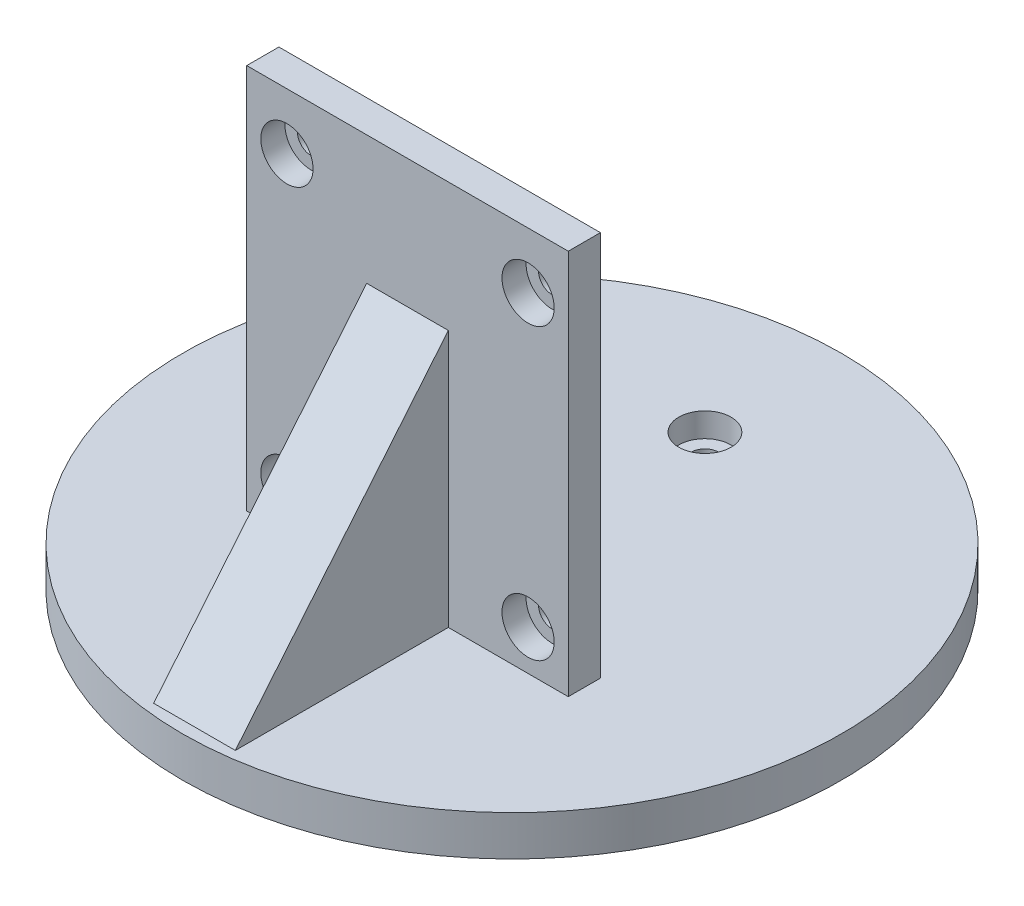
ISO-10303-21;
HEADER;
FILE_DESCRIPTION(('STEP AP214'),'2;1');
FILE_NAME('part.step','',(''),(''),'','','');
FILE_SCHEMA(('AUTOMOTIVE_DESIGN { 1 0 10303 214 1 1 1 1 }'));
ENDSEC;
DATA;
#1=APPLICATION_CONTEXT('core data for automotive mechanical design processes');
#2=APPLICATION_PROTOCOL_DEFINITION('international standard','automotive_design',2000,#1);
#3=PRODUCT_CONTEXT('',#1,'mechanical');
#4=PRODUCT('Part','Part','',(#3));
#5=PRODUCT_RELATED_PRODUCT_CATEGORY('part','',(#4));
#6=PRODUCT_DEFINITION_FORMATION('','',#4);
#7=PRODUCT_DEFINITION_CONTEXT('part definition',#1,'design');
#8=PRODUCT_DEFINITION('design','',#6,#7);
#9=PRODUCT_DEFINITION_SHAPE('','',#8);
#10=(LENGTH_UNIT() NAMED_UNIT(*) SI_UNIT(.MILLI.,.METRE.));
#11=(NAMED_UNIT(*) PLANE_ANGLE_UNIT() SI_UNIT($,.RADIAN.));
#12=(NAMED_UNIT(*) SI_UNIT($,.STERADIAN.) SOLID_ANGLE_UNIT());
#13=UNCERTAINTY_MEASURE_WITH_UNIT(LENGTH_MEASURE(1.E-05),#10,'distance_accuracy_value','');
#14=(GEOMETRIC_REPRESENTATION_CONTEXT(3) GLOBAL_UNCERTAINTY_ASSIGNED_CONTEXT((#13)) GLOBAL_UNIT_ASSIGNED_CONTEXT((#10,
#11,#12)) REPRESENTATION_CONTEXT('',''));
#15=CARTESIAN_POINT('',(0.,0.,0.));
#16=DIRECTION('',(0.,0.,1.));
#17=DIRECTION('',(1.,0.,0.));
#18=AXIS2_PLACEMENT_3D('',#15,#16,#17);
#19=CARTESIAN_POINT('',(0.,5.,0.));
#20=DIRECTION('',(0.,1.,0.));
#21=DIRECTION('',(0.,0.,1.));
#22=AXIS2_PLACEMENT_3D('',#19,#20,#21);
#23=PLANE('',#22);
#24=DIRECTION('',(-1.,0.,0.));
#25=VECTOR('',#24,1.);
#26=CARTESIAN_POINT('',(-19.,5.,-11.));
#27=LINE('',#26,#25);
#28=CARTESIAN_POINT('',(-14.1715728752538,5.,-11.));
#29=VERTEX_POINT('',#28);
#30=CARTESIAN_POINT('',(-19.,5.,-11.));
#31=VERTEX_POINT('',#30);
#32=EDGE_CURVE('E56',#29,#31,#27,.T.);
#33=ORIENTED_EDGE('',*,*,#32,.F.);
#34=DIRECTION('',(0.,0.,-1.));
#35=VECTOR('',#34,1.);
#36=CARTESIAN_POINT('',(-14.1715728752538,5.,4.58155072528997));
#37=LINE('',#36,#35);
#38=CARTESIAN_POINT('',(-14.1715728752538,5.,-0.999999999999992));
#39=VERTEX_POINT('',#38);
#40=EDGE_CURVE('E155',#39,#29,#37,.T.);
#41=ORIENTED_EDGE('',*,*,#40,.F.);
#42=DIRECTION('',(1.,0.,0.));
#43=VECTOR('',#42,1.);
#44=CARTESIAN_POINT('',(-19.,5.,-0.999999999999992));
#45=LINE('',#44,#43);
#46=CARTESIAN_POINT('',(-19.,5.,-0.999999999999992));
#47=VERTEX_POINT('',#46);
#48=EDGE_CURVE('E64',#47,#39,#45,.T.);
#49=ORIENTED_EDGE('',*,*,#48,.F.);
#50=DIRECTION('',(0.,0.,1.));
#51=VECTOR('',#50,1.);
#52=CARTESIAN_POINT('',(-19.,5.,-11.));
#53=LINE('',#52,#51);
#54=EDGE_CURVE('E160',#31,#47,#53,.T.);
#55=ORIENTED_EDGE('',*,*,#54,.F.);
#56=EDGE_LOOP('',(#33,#41,#49,#55));
#57=FACE_BOUND('',#56,.T.);
#58=CARTESIAN_POINT('',(0.,5.,0.));
#59=DIRECTION('',(0.,1.,0.));
#60=DIRECTION('',(0.,0.,1.));
#61=AXIS2_PLACEMENT_3D('',#58,#59,#60);
#62=CIRCLE('',#61,3.25);
#63=CARTESIAN_POINT('',(0.,5.,3.25));
#64=VERTEX_POINT('',#63);
#65=EDGE_CURVE('E165',#64,#64,#62,.T.);
#66=ORIENTED_EDGE('',*,*,#65,.F.);
#67=EDGE_LOOP('',(#66));
#68=FACE_BOUND('',#67,.T.);
#69=CARTESIAN_POINT('',(0.,5.,-24.));
#70=DIRECTION('',(0.,1.,0.));
#71=DIRECTION('',(0.,0.,1.));
#72=AXIS2_PLACEMENT_3D('',#69,#70,#71);
#73=CIRCLE('',#72,3.25);
#74=CARTESIAN_POINT('',(0.,5.,-20.75));
#75=VERTEX_POINT('',#74);
#76=EDGE_CURVE('E175',#75,#75,#73,.T.);
#77=ORIENTED_EDGE('',*,*,#76,.F.);
#78=EDGE_LOOP('',(#77));
#79=FACE_BOUND('',#78,.T.);
#80=CARTESIAN_POINT('',(0.,5.,0.));
#81=DIRECTION('',(0.,1.,0.));
#82=DIRECTION('',(0.,0.,1.));
#83=AXIS2_PLACEMENT_3D('',#80,#81,#82);
#84=CIRCLE('',#83,41.);
#85=CARTESIAN_POINT('',(0.,5.,41.));
#86=VERTEX_POINT('',#85);
#87=EDGE_CURVE('E11',#86,#86,#84,.T.);
#88=ORIENTED_EDGE('',*,*,#87,.T.);
#89=EDGE_LOOP('',(#88));
#90=FACE_BOUND('',#89,.T.);
#91=DIRECTION('',(0.,0.,1.));
#92=VECTOR('',#91,1.);
#93=CARTESIAN_POINT('',(20.,5.,9.));
#94=LINE('',#93,#92);
#95=CARTESIAN_POINT('',(20.,5.,9.));
#96=VERTEX_POINT('',#95);
#97=CARTESIAN_POINT('',(20.,5.,13.));
#98=VERTEX_POINT('',#97);
#99=EDGE_CURVE('E207',#96,#98,#94,.T.);
#100=ORIENTED_EDGE('',*,*,#99,.T.);
#101=DIRECTION('',(-1.,0.,0.));
#102=VECTOR('',#101,1.);
#103=CARTESIAN_POINT('',(20.,5.,13.));
#104=LINE('',#103,#102);
#105=CARTESIAN_POINT('',(5.08,5.,13.));
#106=VERTEX_POINT('',#105);
#107=EDGE_CURVE('E189',#98,#106,#104,.T.);
#108=ORIENTED_EDGE('',*,*,#107,.T.);
#109=DIRECTION('',(0.,0.,-1.));
#110=VECTOR('',#109,1.);
#111=CARTESIAN_POINT('',(5.08,5.,13.));
#112=LINE('',#111,#110);
#113=CARTESIAN_POINT('',(5.08,5.,39.5));
#114=VERTEX_POINT('',#113);
#115=EDGE_CURVE('E221',#114,#106,#112,.T.);
#116=ORIENTED_EDGE('',*,*,#115,.F.);
#117=DIRECTION('',(1.,0.,0.));
#118=VECTOR('',#117,1.);
#119=CARTESIAN_POINT('',(-5.08,5.,39.5));
#120=LINE('',#119,#118);
#121=CARTESIAN_POINT('',(-5.08,5.,39.5));
#122=VERTEX_POINT('',#121);
#123=EDGE_CURVE('E232',#122,#114,#120,.T.);
#124=ORIENTED_EDGE('',*,*,#123,.F.);
#125=DIRECTION('',(0.,0.,-1.));
#126=VECTOR('',#125,1.);
#127=CARTESIAN_POINT('',(-5.08,5.,13.));
#128=LINE('',#127,#126);
#129=CARTESIAN_POINT('',(-5.08,5.,13.));
#130=VERTEX_POINT('',#129);
#131=EDGE_CURVE('E228',#122,#130,#128,.T.);
#132=ORIENTED_EDGE('',*,*,#131,.T.);
#133=CARTESIAN_POINT('',(-20.,5.,13.));
#134=VERTEX_POINT('',#133);
#135=EDGE_CURVE('E203',#130,#134,#104,.T.);
#136=ORIENTED_EDGE('',*,*,#135,.T.);
#137=DIRECTION('',(0.,0.,1.));
#138=VECTOR('',#137,1.);
#139=CARTESIAN_POINT('',(-20.,5.,9.));
#140=LINE('',#139,#138);
#141=CARTESIAN_POINT('',(-20.,5.,9.));
#142=VERTEX_POINT('',#141);
#143=EDGE_CURVE('E195',#142,#134,#140,.T.);
#144=ORIENTED_EDGE('',*,*,#143,.F.);
#145=DIRECTION('',(-1.,0.,0.));
#146=VECTOR('',#145,1.);
#147=CARTESIAN_POINT('',(20.,5.,9.));
#148=LINE('',#147,#146);
#149=EDGE_CURVE('E193',#96,#142,#148,.T.);
#150=ORIENTED_EDGE('',*,*,#149,.F.);
#151=EDGE_LOOP('',(#100,#108,#116,#124,#132,#136,#144,#150));
#152=FACE_BOUND('',#151,.T.);
#153=ADVANCED_FACE('F39',(#57,#68,#79,#90,#152),#23,.T.);
#154=CARTESIAN_POINT('',(0.,5.,0.));
#155=DIRECTION('',(0.,-1.,0.));
#156=DIRECTION('',(0.,0.,-1.));
#157=AXIS2_PLACEMENT_3D('',#154,#155,#156);
#158=CYLINDRICAL_SURFACE('',#157,41.);
#159=ORIENTED_EDGE('',*,*,#87,.F.);
#160=EDGE_LOOP('',(#159));
#161=FACE_BOUND('',#160,.T.);
#162=CARTESIAN_POINT('',(0.,0.,0.));
#163=DIRECTION('',(0.,1.,0.));
#164=DIRECTION('',(0.,0.,1.));
#165=AXIS2_PLACEMENT_3D('',#162,#163,#164);
#166=CIRCLE('',#165,41.);
#167=CARTESIAN_POINT('',(0.,0.,41.));
#168=VERTEX_POINT('',#167);
#169=EDGE_CURVE('E48',#168,#168,#166,.T.);
#170=ORIENTED_EDGE('',*,*,#169,.T.);
#171=EDGE_LOOP('',(#170));
#172=FACE_BOUND('',#171,.T.);
#173=ADVANCED_FACE('F41',(#161,#172),#158,.T.);
#174=CARTESIAN_POINT('',(0.,0.,0.));
#175=DIRECTION('',(0.,1.,0.));
#176=DIRECTION('',(0.,0.,1.));
#177=AXIS2_PLACEMENT_3D('',#174,#175,#176);
#178=PLANE('',#177);
#179=CARTESIAN_POINT('',(0.,0.,0.));
#180=DIRECTION('',(0.,1.,0.));
#181=DIRECTION('',(0.,0.,1.));
#182=AXIS2_PLACEMENT_3D('',#179,#180,#181);
#183=CIRCLE('',#182,1.7);
#184=CARTESIAN_POINT('',(0.,0.,1.7));
#185=VERTEX_POINT('',#184);
#186=EDGE_CURVE('E174',#185,#185,#183,.T.);
#187=ORIENTED_EDGE('',*,*,#186,.T.);
#188=EDGE_LOOP('',(#187));
#189=FACE_BOUND('',#188,.T.);
#190=CARTESIAN_POINT('',(0.,0.,-24.));
#191=DIRECTION('',(0.,1.,0.));
#192=DIRECTION('',(0.,0.,1.));
#193=AXIS2_PLACEMENT_3D('',#190,#191,#192);
#194=CIRCLE('',#193,1.7);
#195=CARTESIAN_POINT('',(0.,0.,-22.3));
#196=VERTEX_POINT('',#195);
#197=EDGE_CURVE('E184',#196,#196,#194,.T.);
#198=ORIENTED_EDGE('',*,*,#197,.T.);
#199=EDGE_LOOP('',(#198));
#200=FACE_BOUND('',#199,.T.);
#201=ORIENTED_EDGE('',*,*,#169,.F.);
#202=EDGE_LOOP('',(#201));
#203=FACE_BOUND('',#202,.T.);
#204=ADVANCED_FACE('F337',(#189,#200,#203),#178,.F.);
#205=CARTESIAN_POINT('',(-5.08,5.,39.5));
#206=DIRECTION('',(0.,0.637813971185366,0.770190455771008));
#207=DIRECTION('',(0.,-0.770190455771008,0.637813971185366));
#208=AXIS2_PLACEMENT_3D('',#205,#206,#207);
#209=PLANE('',#208);
#210=ORIENTED_EDGE('',*,*,#123,.T.);
#211=DIRECTION('',(0.,-0.770190455771008,0.637813971185366));
#212=VECTOR('',#211,1.);
#213=CARTESIAN_POINT('',(5.08,5.,39.5));
#214=LINE('',#213,#212);
#215=CARTESIAN_POINT('',(5.08,37.,13.));
#216=VERTEX_POINT('',#215);
#217=EDGE_CURVE('E219',#216,#114,#214,.T.);
#218=ORIENTED_EDGE('',*,*,#217,.F.);
#219=DIRECTION('',(1.,0.,0.));
#220=VECTOR('',#219,1.);
#221=CARTESIAN_POINT('',(-5.08,37.,13.));
#222=LINE('',#221,#220);
#223=CARTESIAN_POINT('',(-5.08,37.,13.));
#224=VERTEX_POINT('',#223);
#225=EDGE_CURVE('E231',#224,#216,#222,.T.);
#226=ORIENTED_EDGE('',*,*,#225,.F.);
#227=DIRECTION('',(0.,-0.770190455771008,0.637813971185366));
#228=VECTOR('',#227,1.);
#229=CARTESIAN_POINT('',(-5.08,5.,39.5));
#230=LINE('',#229,#228);
#231=EDGE_CURVE('E226',#224,#122,#230,.T.);
#232=ORIENTED_EDGE('',*,*,#231,.T.);
#233=EDGE_LOOP('',(#210,#218,#226,#232));
#234=FACE_BOUND('',#233,.T.);
#235=ADVANCED_FACE('F308',(#234),#209,.T.);
#236=CARTESIAN_POINT('',(-5.08,0.,0.));
#237=DIRECTION('',(-1.,0.,0.));
#238=DIRECTION('',(0.,0.,1.));
#239=AXIS2_PLACEMENT_3D('',#236,#237,#238);
#240=PLANE('',#239);
#241=DIRECTION('',(0.,1.,0.));
#242=VECTOR('',#241,1.);
#243=CARTESIAN_POINT('',(-5.08,37.,13.));
#244=LINE('',#243,#242);
#245=EDGE_CURVE('E224',#130,#224,#244,.T.);
#246=ORIENTED_EDGE('',*,*,#245,.F.);
#247=ORIENTED_EDGE('',*,*,#131,.F.);
#248=ORIENTED_EDGE('',*,*,#231,.F.);
#249=EDGE_LOOP('',(#246,#247,#248));
#250=FACE_BOUND('',#249,.T.);
#251=ADVANCED_FACE('F312',(#250),#240,.T.);
#252=CARTESIAN_POINT('',(5.08,0.,0.));
#253=DIRECTION('',(-1.,0.,0.));
#254=DIRECTION('',(0.,0.,1.));
#255=AXIS2_PLACEMENT_3D('',#252,#253,#254);
#256=PLANE('',#255);
#257=DIRECTION('',(0.,1.,0.));
#258=VECTOR('',#257,1.);
#259=CARTESIAN_POINT('',(5.08,37.,13.));
#260=LINE('',#259,#258);
#261=EDGE_CURVE('E216',#106,#216,#260,.T.);
#262=ORIENTED_EDGE('',*,*,#261,.T.);
#263=ORIENTED_EDGE('',*,*,#217,.T.);
#264=ORIENTED_EDGE('',*,*,#115,.T.);
#265=EDGE_LOOP('',(#262,#263,#264));
#266=FACE_BOUND('',#265,.T.);
#267=ADVANCED_FACE('F303',(#266),#256,.F.);
#268=CARTESIAN_POINT('',(-20.,53.,9.00000000000001));
#269=DIRECTION('',(1.,0.,0.));
#270=DIRECTION('',(0.,1.,0.));
#271=AXIS2_PLACEMENT_3D('',#268,#269,#270);
#272=PLANE('',#271);
#273=DIRECTION('',(0.,1.,0.));
#274=VECTOR('',#273,1.);
#275=CARTESIAN_POINT('',(-20.,53.,13.));
#276=LINE('',#275,#274);
#277=CARTESIAN_POINT('',(-20.,53.,13.));
#278=VERTEX_POINT('',#277);
#279=EDGE_CURVE('E196',#134,#278,#276,.T.);
#280=ORIENTED_EDGE('',*,*,#279,.T.);
#281=DIRECTION('',(0.,0.,1.));
#282=VECTOR('',#281,1.);
#283=CARTESIAN_POINT('',(-20.,53.,9.00000000000001));
#284=LINE('',#283,#282);
#285=CARTESIAN_POINT('',(-20.,53.,9.00000000000001));
#286=VERTEX_POINT('',#285);
#287=EDGE_CURVE('E213',#286,#278,#284,.T.);
#288=ORIENTED_EDGE('',*,*,#287,.F.);
#289=DIRECTION('',(0.,1.,0.));
#290=VECTOR('',#289,1.);
#291=CARTESIAN_POINT('',(-20.,53.,9.00000000000001));
#292=LINE('',#291,#290);
#293=EDGE_CURVE('E185',#142,#286,#292,.T.);
#294=ORIENTED_EDGE('',*,*,#293,.F.);
#295=ORIENTED_EDGE('',*,*,#143,.T.);
#296=EDGE_LOOP('',(#280,#288,#294,#295));
#297=FACE_BOUND('',#296,.T.);
#298=ADVANCED_FACE('F316',(#297),#272,.F.);
#299=CARTESIAN_POINT('',(20.,53.,9.00000000000001));
#300=DIRECTION('',(0.,-1.,0.));
#301=DIRECTION('',(0.,0.,-1.));
#302=AXIS2_PLACEMENT_3D('',#299,#300,#301);
#303=PLANE('',#302);
#304=DIRECTION('',(1.,0.,0.));
#305=VECTOR('',#304,1.);
#306=CARTESIAN_POINT('',(20.,53.,13.));
#307=LINE('',#306,#305);
#308=CARTESIAN_POINT('',(20.,53.,13.));
#309=VERTEX_POINT('',#308);
#310=EDGE_CURVE('E199',#278,#309,#307,.T.);
#311=ORIENTED_EDGE('',*,*,#310,.T.);
#312=DIRECTION('',(0.,0.,1.));
#313=VECTOR('',#312,1.);
#314=CARTESIAN_POINT('',(20.,53.,9.00000000000001));
#315=LINE('',#314,#313);
#316=CARTESIAN_POINT('',(20.,53.,9.00000000000001));
#317=VERTEX_POINT('',#316);
#318=EDGE_CURVE('E210',#317,#309,#315,.T.);
#319=ORIENTED_EDGE('',*,*,#318,.F.);
#320=DIRECTION('',(1.,0.,0.));
#321=VECTOR('',#320,1.);
#322=CARTESIAN_POINT('',(20.,53.,9.00000000000001));
#323=LINE('',#322,#321);
#324=EDGE_CURVE('E188',#286,#317,#323,.T.);
#325=ORIENTED_EDGE('',*,*,#324,.F.);
#326=ORIENTED_EDGE('',*,*,#287,.T.);
#327=EDGE_LOOP('',(#311,#319,#325,#326));
#328=FACE_BOUND('',#327,.T.);
#329=ADVANCED_FACE('F321',(#328),#303,.F.);
#330=CARTESIAN_POINT('',(20.,53.,9.00000000000001));
#331=DIRECTION('',(-1.,0.,0.));
#332=DIRECTION('',(0.,-1.,0.));
#333=AXIS2_PLACEMENT_3D('',#330,#331,#332);
#334=PLANE('',#333);
#335=DIRECTION('',(0.,-1.,0.));
#336=VECTOR('',#335,1.);
#337=CARTESIAN_POINT('',(20.,53.,13.));
#338=LINE('',#337,#336);
#339=EDGE_CURVE('E201',#309,#98,#338,.T.);
#340=ORIENTED_EDGE('',*,*,#339,.T.);
#341=ORIENTED_EDGE('',*,*,#99,.F.);
#342=DIRECTION('',(0.,-1.,0.));
#343=VECTOR('',#342,1.);
#344=CARTESIAN_POINT('',(20.,53.,9.00000000000001));
#345=LINE('',#344,#343);
#346=EDGE_CURVE('E191',#317,#96,#345,.T.);
#347=ORIENTED_EDGE('',*,*,#346,.F.);
#348=ORIENTED_EDGE('',*,*,#318,.T.);
#349=EDGE_LOOP('',(#340,#341,#347,#348));
#350=FACE_BOUND('',#349,.T.);
#351=ADVANCED_FACE('F295',(#350),#334,.F.);
#352=CARTESIAN_POINT('',(0.,0.,9.));
#353=DIRECTION('',(0.,0.,-1.));
#354=DIRECTION('',(0.,1.,0.));
#355=AXIS2_PLACEMENT_3D('',#352,#353,#354);
#356=PLANE('',#355);
#357=CARTESIAN_POINT('',(15.,10.,9.));
#358=DIRECTION('',(0.,0.,-1.));
#359=DIRECTION('',(0.,1.,0.));
#360=AXIS2_PLACEMENT_3D('',#357,#358,#359);
#361=CIRCLE('',#360,1.7);
#362=CARTESIAN_POINT('',(15.,11.7,9.));
#363=VERTEX_POINT('',#362);
#364=EDGE_CURVE('E43',#363,#363,#361,.T.);
#365=ORIENTED_EDGE('',*,*,#364,.F.);
#366=EDGE_LOOP('',(#365));
#367=FACE_BOUND('',#366,.T.);
#368=CARTESIAN_POINT('',(-15.,10.,9.));
#369=DIRECTION('',(0.,0.,-1.));
#370=DIRECTION('',(0.,1.,0.));
#371=AXIS2_PLACEMENT_3D('',#368,#369,#370);
#372=CIRCLE('',#371,1.7);
#373=CARTESIAN_POINT('',(-15.,11.7,9.));
#374=VERTEX_POINT('',#373);
#375=EDGE_CURVE('E246',#374,#374,#372,.T.);
#376=ORIENTED_EDGE('',*,*,#375,.F.);
#377=EDGE_LOOP('',(#376));
#378=FACE_BOUND('',#377,.T.);
#379=CARTESIAN_POINT('',(-15.,46.,9.00000000000001));
#380=DIRECTION('',(0.,0.,-1.));
#381=DIRECTION('',(0.,1.,0.));
#382=AXIS2_PLACEMENT_3D('',#379,#380,#381);
#383=CIRCLE('',#382,1.7);
#384=CARTESIAN_POINT('',(-15.,47.7,9.00000000000001));
#385=VERTEX_POINT('',#384);
#386=EDGE_CURVE('E242',#385,#385,#383,.T.);
#387=ORIENTED_EDGE('',*,*,#386,.F.);
#388=EDGE_LOOP('',(#387));
#389=FACE_BOUND('',#388,.T.);
#390=CARTESIAN_POINT('',(15.,46.,9.00000000000001));
#391=DIRECTION('',(0.,0.,-1.));
#392=DIRECTION('',(0.,1.,0.));
#393=AXIS2_PLACEMENT_3D('',#390,#391,#392);
#394=CIRCLE('',#393,1.7);
#395=CARTESIAN_POINT('',(15.,47.7,9.00000000000001));
#396=VERTEX_POINT('',#395);
#397=EDGE_CURVE('E145',#396,#396,#394,.T.);
#398=ORIENTED_EDGE('',*,*,#397,.F.);
#399=EDGE_LOOP('',(#398));
#400=FACE_BOUND('',#399,.T.);
#401=ORIENTED_EDGE('',*,*,#293,.T.);
#402=ORIENTED_EDGE('',*,*,#324,.T.);
#403=ORIENTED_EDGE('',*,*,#346,.T.);
#404=ORIENTED_EDGE('',*,*,#149,.T.);
#405=EDGE_LOOP('',(#401,#402,#403,#404));
#406=FACE_BOUND('',#405,.T.);
#407=ADVANCED_FACE('F319',(#367,#378,#389,#400,#406),#356,.T.);
#408=CARTESIAN_POINT('',(0.,0.,13.));
#409=DIRECTION('',(0.,0.,-1.));
#410=DIRECTION('',(0.,1.,0.));
#411=AXIS2_PLACEMENT_3D('',#408,#409,#410);
#412=PLANE('',#411);
#413=CARTESIAN_POINT('',(15.,10.,13.));
#414=DIRECTION('',(0.,0.,1.));
#415=DIRECTION('',(1.,0.,0.));
#416=AXIS2_PLACEMENT_3D('',#413,#414,#415);
#417=CIRCLE('',#416,3.25);
#418=CARTESIAN_POINT('',(18.25,10.,13.));
#419=VERTEX_POINT('',#418);
#420=EDGE_CURVE('E589',#419,#419,#417,.T.);
#421=ORIENTED_EDGE('',*,*,#420,.F.);
#422=EDGE_LOOP('',(#421));
#423=FACE_BOUND('',#422,.T.);
#424=CARTESIAN_POINT('',(-15.,10.,13.));
#425=DIRECTION('',(0.,0.,1.));
#426=DIRECTION('',(1.,0.,0.));
#427=AXIS2_PLACEMENT_3D('',#424,#425,#426);
#428=CIRCLE('',#427,3.25);
#429=CARTESIAN_POINT('',(-11.75,10.,13.));
#430=VERTEX_POINT('',#429);
#431=EDGE_CURVE('E261',#430,#430,#428,.T.);
#432=ORIENTED_EDGE('',*,*,#431,.F.);
#433=EDGE_LOOP('',(#432));
#434=FACE_BOUND('',#433,.T.);
#435=CARTESIAN_POINT('',(-15.,46.,13.));
#436=DIRECTION('',(0.,0.,1.));
#437=DIRECTION('',(1.,0.,0.));
#438=AXIS2_PLACEMENT_3D('',#435,#436,#437);
#439=CIRCLE('',#438,3.25);
#440=CARTESIAN_POINT('',(-11.75,46.,13.));
#441=VERTEX_POINT('',#440);
#442=EDGE_CURVE('E248',#441,#441,#439,.T.);
#443=ORIENTED_EDGE('',*,*,#442,.F.);
#444=EDGE_LOOP('',(#443));
#445=FACE_BOUND('',#444,.T.);
#446=CARTESIAN_POINT('',(15.,46.,13.));
#447=DIRECTION('',(0.,0.,1.));
#448=DIRECTION('',(1.,0.,0.));
#449=AXIS2_PLACEMENT_3D('',#446,#447,#448);
#450=CIRCLE('',#449,3.25);
#451=CARTESIAN_POINT('',(18.25,46.,13.));
#452=VERTEX_POINT('',#451);
#453=EDGE_CURVE('E244',#452,#452,#450,.T.);
#454=ORIENTED_EDGE('',*,*,#453,.F.);
#455=EDGE_LOOP('',(#454));
#456=FACE_BOUND('',#455,.T.);
#457=ORIENTED_EDGE('',*,*,#245,.T.);
#458=ORIENTED_EDGE('',*,*,#225,.T.);
#459=ORIENTED_EDGE('',*,*,#261,.F.);
#460=ORIENTED_EDGE('',*,*,#107,.F.);
#461=ORIENTED_EDGE('',*,*,#339,.F.);
#462=ORIENTED_EDGE('',*,*,#310,.F.);
#463=ORIENTED_EDGE('',*,*,#279,.F.);
#464=ORIENTED_EDGE('',*,*,#135,.F.);
#465=EDGE_LOOP('',(#457,#458,#459,#460,#461,#462,#463,#464));
#466=FACE_BOUND('',#465,.T.);
#467=ADVANCED_FACE('F299',(#423,#434,#445,#456,#466),#412,.F.);
#468=CARTESIAN_POINT('',(0.,5.,-24.));
#469=DIRECTION('',(0.,1.,0.));
#470=DIRECTION('',(0.,0.,1.));
#471=AXIS2_PLACEMENT_3D('',#468,#469,#470);
#472=CYLINDRICAL_SURFACE('',#471,1.7);
#473=CARTESIAN_POINT('',(0.,2.,-24.));
#474=DIRECTION('',(0.,1.,0.));
#475=DIRECTION('',(0.,0.,1.));
#476=AXIS2_PLACEMENT_3D('',#473,#474,#475);
#477=CIRCLE('',#476,1.7);
#478=CARTESIAN_POINT('',(0.,2.,-22.3));
#479=VERTEX_POINT('',#478);
#480=EDGE_CURVE('E181',#479,#479,#477,.T.);
#481=ORIENTED_EDGE('',*,*,#480,.T.);
#482=EDGE_LOOP('',(#481));
#483=FACE_BOUND('',#482,.T.);
#484=ORIENTED_EDGE('',*,*,#197,.F.);
#485=EDGE_LOOP('',(#484));
#486=FACE_BOUND('',#485,.T.);
#487=ADVANCED_FACE('F352',(#483,#486),#472,.F.);
#488=CARTESIAN_POINT('',(1.7,2.,-24.));
#489=DIRECTION('',(0.,-1.,0.));
#490=DIRECTION('',(0.,0.,-1.));
#491=AXIS2_PLACEMENT_3D('',#488,#489,#490);
#492=PLANE('',#491);
#493=ORIENTED_EDGE('',*,*,#480,.F.);
#494=EDGE_LOOP('',(#493));
#495=FACE_BOUND('',#494,.T.);
#496=CARTESIAN_POINT('',(0.,2.,-24.));
#497=DIRECTION('',(0.,1.,0.));
#498=DIRECTION('',(0.,0.,1.));
#499=AXIS2_PLACEMENT_3D('',#496,#497,#498);
#500=CIRCLE('',#499,3.25);
#501=CARTESIAN_POINT('',(0.,2.,-20.75));
#502=VERTEX_POINT('',#501);
#503=EDGE_CURVE('E178',#502,#502,#500,.T.);
#504=ORIENTED_EDGE('',*,*,#503,.T.);
#505=EDGE_LOOP('',(#504));
#506=FACE_BOUND('',#505,.T.);
#507=ADVANCED_FACE('F353',(#495,#506),#492,.F.);
#508=CARTESIAN_POINT('',(0.,5.,-24.));
#509=DIRECTION('',(0.,1.,0.));
#510=DIRECTION('',(0.,0.,1.));
#511=AXIS2_PLACEMENT_3D('',#508,#509,#510);
#512=CYLINDRICAL_SURFACE('',#511,3.25);
#513=ORIENTED_EDGE('',*,*,#503,.F.);
#514=EDGE_LOOP('',(#513));
#515=FACE_BOUND('',#514,.T.);
#516=ORIENTED_EDGE('',*,*,#76,.T.);
#517=EDGE_LOOP('',(#516));
#518=FACE_BOUND('',#517,.T.);
#519=ADVANCED_FACE('F359',(#515,#518),#512,.F.);
#520=CARTESIAN_POINT('',(0.,5.,0.));
#521=DIRECTION('',(0.,1.,0.));
#522=DIRECTION('',(0.,0.,1.));
#523=AXIS2_PLACEMENT_3D('',#520,#521,#522);
#524=CYLINDRICAL_SURFACE('',#523,1.7);
#525=CARTESIAN_POINT('',(0.,2.,0.));
#526=DIRECTION('',(0.,1.,0.));
#527=DIRECTION('',(0.,0.,1.));
#528=AXIS2_PLACEMENT_3D('',#525,#526,#527);
#529=CIRCLE('',#528,1.7);
#530=CARTESIAN_POINT('',(0.,2.,1.7));
#531=VERTEX_POINT('',#530);
#532=EDGE_CURVE('E171',#531,#531,#529,.T.);
#533=ORIENTED_EDGE('',*,*,#532,.T.);
#534=EDGE_LOOP('',(#533));
#535=FACE_BOUND('',#534,.T.);
#536=ORIENTED_EDGE('',*,*,#186,.F.);
#537=EDGE_LOOP('',(#536));
#538=FACE_BOUND('',#537,.T.);
#539=ADVANCED_FACE('F422',(#535,#538),#524,.F.);
#540=CARTESIAN_POINT('',(1.7,2.,0.));
#541=DIRECTION('',(0.,-1.,0.));
#542=DIRECTION('',(0.,0.,-1.));
#543=AXIS2_PLACEMENT_3D('',#540,#541,#542);
#544=PLANE('',#543);
#545=ORIENTED_EDGE('',*,*,#532,.F.);
#546=EDGE_LOOP('',(#545));
#547=FACE_BOUND('',#546,.T.);
#548=CARTESIAN_POINT('',(0.,2.,0.));
#549=DIRECTION('',(0.,1.,0.));
#550=DIRECTION('',(0.,0.,1.));
#551=AXIS2_PLACEMENT_3D('',#548,#549,#550);
#552=CIRCLE('',#551,3.25);
#553=CARTESIAN_POINT('',(0.,2.,3.25));
#554=VERTEX_POINT('',#553);
#555=EDGE_CURVE('E168',#554,#554,#552,.T.);
#556=ORIENTED_EDGE('',*,*,#555,.T.);
#557=EDGE_LOOP('',(#556));
#558=FACE_BOUND('',#557,.T.);
#559=ADVANCED_FACE('F418',(#547,#558),#544,.F.);
#560=CARTESIAN_POINT('',(0.,5.,0.));
#561=DIRECTION('',(0.,1.,0.));
#562=DIRECTION('',(0.,0.,1.));
#563=AXIS2_PLACEMENT_3D('',#560,#561,#562);
#564=CYLINDRICAL_SURFACE('',#563,3.25);
#565=ORIENTED_EDGE('',*,*,#555,.F.);
#566=EDGE_LOOP('',(#565));
#567=FACE_BOUND('',#566,.T.);
#568=ORIENTED_EDGE('',*,*,#65,.T.);
#569=EDGE_LOOP('',(#568));
#570=FACE_BOUND('',#569,.T.);
#571=ADVANCED_FACE('F415',(#567,#570),#564,.F.);
#572=CARTESIAN_POINT('',(-19.,7.,-11.));
#573=DIRECTION('',(1.,0.,0.));
#574=DIRECTION('',(0.,0.,-1.));
#575=AXIS2_PLACEMENT_3D('',#572,#573,#574);
#576=PLANE('',#575);
#577=ORIENTED_EDGE('',*,*,#54,.T.);
#578=DIRECTION('',(0.,-1.,0.));
#579=VECTOR('',#578,1.);
#580=CARTESIAN_POINT('',(-19.,7.,-0.999999999999992));
#581=LINE('',#580,#579);
#582=CARTESIAN_POINT('',(-19.,7.8,-0.999999999999992));
#583=VERTEX_POINT('',#582);
#584=EDGE_CURVE('E131',#583,#47,#581,.T.);
#585=ORIENTED_EDGE('',*,*,#584,.F.);
#586=DIRECTION('',(0.,0.,-1.));
#587=VECTOR('',#586,1.);
#588=CARTESIAN_POINT('',(-19.,7.8,4.58155072528996));
#589=LINE('',#588,#587);
#590=CARTESIAN_POINT('',(-19.,7.8,-11.));
#591=VERTEX_POINT('',#590);
#592=EDGE_CURVE('E134',#583,#591,#589,.T.);
#593=ORIENTED_EDGE('',*,*,#592,.T.);
#594=DIRECTION('',(0.,-1.,0.));
#595=VECTOR('',#594,1.);
#596=CARTESIAN_POINT('',(-19.,7.,-11.));
#597=LINE('',#596,#595);
#598=EDGE_CURVE('E124',#591,#31,#597,.T.);
#599=ORIENTED_EDGE('',*,*,#598,.T.);
#600=EDGE_LOOP('',(#577,#585,#593,#599));
#601=FACE_BOUND('',#600,.T.);
#602=ADVANCED_FACE('F135',(#601),#576,.F.);
#603=CARTESIAN_POINT('',(-19.,7.,-0.999999999999992));
#604=DIRECTION('',(0.,0.,-1.));
#605=DIRECTION('',(-1.,0.,0.));
#606=AXIS2_PLACEMENT_3D('',#603,#604,#605);
#607=PLANE('',#606);
#608=ORIENTED_EDGE('',*,*,#48,.T.);
#609=DIRECTION('',(-0.382683432365094,0.923879532511285,0.));
#610=VECTOR('',#609,1.);
#611=CARTESIAN_POINT('',(-14.1715728752538,5.,-0.999999999999992));
#612=LINE('',#611,#610);
#613=CARTESIAN_POINT('',(-15.3313708498985,7.8,-0.999999999999992));
#614=VERTEX_POINT('',#613);
#615=EDGE_CURVE('E152',#39,#614,#612,.T.);
#616=ORIENTED_EDGE('',*,*,#615,.T.);
#617=DIRECTION('',(-1.,0.,0.));
#618=VECTOR('',#617,1.);
#619=CARTESIAN_POINT('',(-15.3313708498985,7.8,-0.999999999999992));
#620=LINE('',#619,#618);
#621=EDGE_CURVE('E158',#614,#583,#620,.T.);
#622=ORIENTED_EDGE('',*,*,#621,.T.);
#623=ORIENTED_EDGE('',*,*,#584,.T.);
#624=EDGE_LOOP('',(#608,#616,#622,#623));
#625=FACE_BOUND('',#624,.T.);
#626=ADVANCED_FACE('F276',(#625),#607,.F.);
#627=CARTESIAN_POINT('',(-19.,7.,-11.));
#628=DIRECTION('',(0.,0.,1.));
#629=DIRECTION('',(1.,0.,0.));
#630=AXIS2_PLACEMENT_3D('',#627,#628,#629);
#631=PLANE('',#630);
#632=ORIENTED_EDGE('',*,*,#32,.T.);
#633=ORIENTED_EDGE('',*,*,#598,.F.);
#634=DIRECTION('',(1.,0.,0.));
#635=VECTOR('',#634,1.);
#636=CARTESIAN_POINT('',(-15.3313708498985,7.8,-11.));
#637=LINE('',#636,#635);
#638=CARTESIAN_POINT('',(-15.3313708498985,7.8,-11.));
#639=VERTEX_POINT('',#638);
#640=EDGE_CURVE('E128',#591,#639,#637,.T.);
#641=ORIENTED_EDGE('',*,*,#640,.T.);
#642=DIRECTION('',(0.382683432365094,-0.923879532511285,0.));
#643=VECTOR('',#642,1.);
#644=CARTESIAN_POINT('',(-14.1715728752538,5.,-11.));
#645=LINE('',#644,#643);
#646=EDGE_CURVE('E140',#639,#29,#645,.T.);
#647=ORIENTED_EDGE('',*,*,#646,.T.);
#648=EDGE_LOOP('',(#632,#633,#641,#647));
#649=FACE_BOUND('',#648,.T.);
#650=ADVANCED_FACE('F126',(#649),#631,.F.);
#651=CARTESIAN_POINT('',(-14.1715728752538,5.,4.58155072528997));
#652=DIRECTION('',(0.923879532511285,0.382683432365094,0.));
#653=DIRECTION('',(-0.382683432365094,0.923879532511285,0.));
#654=AXIS2_PLACEMENT_3D('',#651,#652,#653);
#655=PLANE('',#654);
#656=ORIENTED_EDGE('',*,*,#646,.F.);
#657=DIRECTION('',(0.,0.,-1.));
#658=VECTOR('',#657,1.);
#659=CARTESIAN_POINT('',(-15.3313708498985,7.8,4.58155072528997));
#660=LINE('',#659,#658);
#661=EDGE_CURVE('E139',#614,#639,#660,.T.);
#662=ORIENTED_EDGE('',*,*,#661,.F.);
#663=ORIENTED_EDGE('',*,*,#615,.F.);
#664=ORIENTED_EDGE('',*,*,#40,.T.);
#665=EDGE_LOOP('',(#656,#662,#663,#664));
#666=FACE_BOUND('',#665,.T.);
#667=ADVANCED_FACE('F278',(#666),#655,.T.);
#668=CARTESIAN_POINT('',(-15.3313708498985,7.8,4.58155072528997));
#669=DIRECTION('',(0.,1.,0.));
#670=DIRECTION('',(0.,0.,1.));
#671=AXIS2_PLACEMENT_3D('',#668,#669,#670);
#672=PLANE('',#671);
#673=ORIENTED_EDGE('',*,*,#621,.F.);
#674=ORIENTED_EDGE('',*,*,#661,.T.);
#675=ORIENTED_EDGE('',*,*,#640,.F.);
#676=ORIENTED_EDGE('',*,*,#592,.F.);
#677=EDGE_LOOP('',(#673,#674,#675,#676));
#678=FACE_BOUND('',#677,.T.);
#679=ADVANCED_FACE('F143',(#678),#672,.T.);
#680=CARTESIAN_POINT('',(15.,46.,13.));
#681=DIRECTION('',(0.,0.,1.));
#682=DIRECTION('',(1.,0.,0.));
#683=AXIS2_PLACEMENT_3D('',#680,#681,#682);
#684=CYLINDRICAL_SURFACE('',#683,1.7);
#685=ORIENTED_EDGE('',*,*,#397,.T.);
#686=EDGE_LOOP('',(#685));
#687=FACE_BOUND('',#686,.T.);
#688=CARTESIAN_POINT('',(15.,46.,10.));
#689=DIRECTION('',(0.,0.,1.));
#690=DIRECTION('',(1.,0.,0.));
#691=AXIS2_PLACEMENT_3D('',#688,#689,#690);
#692=CIRCLE('',#691,1.7);
#693=CARTESIAN_POINT('',(16.7,46.,10.));
#694=VERTEX_POINT('',#693);
#695=EDGE_CURVE('E149',#694,#694,#692,.T.);
#696=ORIENTED_EDGE('',*,*,#695,.T.);
#697=EDGE_LOOP('',(#696));
#698=FACE_BOUND('',#697,.T.);
#699=ADVANCED_FACE('F379',(#687,#698),#684,.F.);
#700=CARTESIAN_POINT('',(16.7,46.,10.));
#701=DIRECTION('',(0.,0.,-1.));
#702=DIRECTION('',(-1.,0.,0.));
#703=AXIS2_PLACEMENT_3D('',#700,#701,#702);
#704=PLANE('',#703);
#705=ORIENTED_EDGE('',*,*,#695,.F.);
#706=EDGE_LOOP('',(#705));
#707=FACE_BOUND('',#706,.T.);
#708=CARTESIAN_POINT('',(15.,46.,10.));
#709=DIRECTION('',(0.,0.,1.));
#710=DIRECTION('',(1.,0.,0.));
#711=AXIS2_PLACEMENT_3D('',#708,#709,#710);
#712=CIRCLE('',#711,3.25);
#713=CARTESIAN_POINT('',(18.25,46.,10.));
#714=VERTEX_POINT('',#713);
#715=EDGE_CURVE('E271',#714,#714,#712,.T.);
#716=ORIENTED_EDGE('',*,*,#715,.T.);
#717=EDGE_LOOP('',(#716));
#718=FACE_BOUND('',#717,.T.);
#719=ADVANCED_FACE('F382',(#707,#718),#704,.F.);
#720=CARTESIAN_POINT('',(15.,46.,13.));
#721=DIRECTION('',(0.,0.,1.));
#722=DIRECTION('',(1.,0.,0.));
#723=AXIS2_PLACEMENT_3D('',#720,#721,#722);
#724=CYLINDRICAL_SURFACE('',#723,3.25);
#725=ORIENTED_EDGE('',*,*,#715,.F.);
#726=EDGE_LOOP('',(#725));
#727=FACE_BOUND('',#726,.T.);
#728=ORIENTED_EDGE('',*,*,#453,.T.);
#729=EDGE_LOOP('',(#728));
#730=FACE_BOUND('',#729,.T.);
#731=ADVANCED_FACE('F388',(#727,#730),#724,.F.);
#732=CARTESIAN_POINT('',(-15.,46.,13.));
#733=DIRECTION('',(0.,0.,1.));
#734=DIRECTION('',(1.,0.,0.));
#735=AXIS2_PLACEMENT_3D('',#732,#733,#734);
#736=CYLINDRICAL_SURFACE('',#735,1.7);
#737=ORIENTED_EDGE('',*,*,#386,.T.);
#738=EDGE_LOOP('',(#737));
#739=FACE_BOUND('',#738,.T.);
#740=CARTESIAN_POINT('',(-15.,46.,10.));
#741=DIRECTION('',(0.,0.,1.));
#742=DIRECTION('',(1.,0.,0.));
#743=AXIS2_PLACEMENT_3D('',#740,#741,#742);
#744=CIRCLE('',#743,1.7);
#745=CARTESIAN_POINT('',(-13.3,46.,10.));
#746=VERTEX_POINT('',#745);
#747=EDGE_CURVE('E245',#746,#746,#744,.T.);
#748=ORIENTED_EDGE('',*,*,#747,.T.);
#749=EDGE_LOOP('',(#748));
#750=FACE_BOUND('',#749,.T.);
#751=ADVANCED_FACE('F394',(#739,#750),#736,.F.);
#752=CARTESIAN_POINT('',(-13.3,46.,10.));
#753=DIRECTION('',(0.,0.,-1.));
#754=DIRECTION('',(-1.,0.,0.));
#755=AXIS2_PLACEMENT_3D('',#752,#753,#754);
#756=PLANE('',#755);
#757=ORIENTED_EDGE('',*,*,#747,.F.);
#758=EDGE_LOOP('',(#757));
#759=FACE_BOUND('',#758,.T.);
#760=CARTESIAN_POINT('',(-15.,46.,10.));
#761=DIRECTION('',(0.,0.,1.));
#762=DIRECTION('',(1.,0.,0.));
#763=AXIS2_PLACEMENT_3D('',#760,#761,#762);
#764=CIRCLE('',#763,3.25);
#765=CARTESIAN_POINT('',(-11.75,46.,10.));
#766=VERTEX_POINT('',#765);
#767=EDGE_CURVE('E253',#766,#766,#764,.T.);
#768=ORIENTED_EDGE('',*,*,#767,.T.);
#769=EDGE_LOOP('',(#768));
#770=FACE_BOUND('',#769,.T.);
#771=ADVANCED_FACE('F401',(#759,#770),#756,.F.);
#772=CARTESIAN_POINT('',(-15.,46.,13.));
#773=DIRECTION('',(0.,0.,1.));
#774=DIRECTION('',(1.,0.,0.));
#775=AXIS2_PLACEMENT_3D('',#772,#773,#774);
#776=CYLINDRICAL_SURFACE('',#775,3.25);
#777=ORIENTED_EDGE('',*,*,#767,.F.);
#778=EDGE_LOOP('',(#777));
#779=FACE_BOUND('',#778,.T.);
#780=ORIENTED_EDGE('',*,*,#442,.T.);
#781=EDGE_LOOP('',(#780));
#782=FACE_BOUND('',#781,.T.);
#783=ADVANCED_FACE('F512',(#779,#782),#776,.F.);
#784=CARTESIAN_POINT('',(-15.,10.,13.));
#785=DIRECTION('',(0.,0.,1.));
#786=DIRECTION('',(1.,0.,0.));
#787=AXIS2_PLACEMENT_3D('',#784,#785,#786);
#788=CYLINDRICAL_SURFACE('',#787,1.7);
#789=ORIENTED_EDGE('',*,*,#375,.T.);
#790=EDGE_LOOP('',(#789));
#791=FACE_BOUND('',#790,.T.);
#792=CARTESIAN_POINT('',(-15.,10.,10.));
#793=DIRECTION('',(0.,0.,1.));
#794=DIRECTION('',(1.,0.,0.));
#795=AXIS2_PLACEMENT_3D('',#792,#793,#794);
#796=CIRCLE('',#795,1.7);
#797=CARTESIAN_POINT('',(-13.3,10.,10.));
#798=VERTEX_POINT('',#797);
#799=EDGE_CURVE('E249',#798,#798,#796,.T.);
#800=ORIENTED_EDGE('',*,*,#799,.T.);
#801=EDGE_LOOP('',(#800));
#802=FACE_BOUND('',#801,.T.);
#803=ADVANCED_FACE('F521',(#791,#802),#788,.F.);
#804=CARTESIAN_POINT('',(-13.3,10.,10.));
#805=DIRECTION('',(0.,0.,-1.));
#806=DIRECTION('',(-1.,0.,0.));
#807=AXIS2_PLACEMENT_3D('',#804,#805,#806);
#808=PLANE('',#807);
#809=ORIENTED_EDGE('',*,*,#799,.F.);
#810=EDGE_LOOP('',(#809));
#811=FACE_BOUND('',#810,.T.);
#812=CARTESIAN_POINT('',(-15.,10.,10.));
#813=DIRECTION('',(0.,0.,1.));
#814=DIRECTION('',(1.,0.,0.));
#815=AXIS2_PLACEMENT_3D('',#812,#813,#814);
#816=CIRCLE('',#815,3.25);
#817=CARTESIAN_POINT('',(-11.75,10.,10.));
#818=VERTEX_POINT('',#817);
#819=EDGE_CURVE('E256',#818,#818,#816,.T.);
#820=ORIENTED_EDGE('',*,*,#819,.T.);
#821=EDGE_LOOP('',(#820));
#822=FACE_BOUND('',#821,.T.);
#823=ADVANCED_FACE('F531',(#811,#822),#808,.F.);
#824=CARTESIAN_POINT('',(-15.,10.,13.));
#825=DIRECTION('',(0.,0.,1.));
#826=DIRECTION('',(1.,0.,0.));
#827=AXIS2_PLACEMENT_3D('',#824,#825,#826);
#828=CYLINDRICAL_SURFACE('',#827,3.25);
#829=ORIENTED_EDGE('',*,*,#819,.F.);
#830=EDGE_LOOP('',(#829));
#831=FACE_BOUND('',#830,.T.);
#832=ORIENTED_EDGE('',*,*,#431,.T.);
#833=EDGE_LOOP('',(#832));
#834=FACE_BOUND('',#833,.T.);
#835=ADVANCED_FACE('F540',(#831,#834),#828,.F.);
#836=CARTESIAN_POINT('',(15.,10.,13.));
#837=DIRECTION('',(0.,0.,1.));
#838=DIRECTION('',(1.,0.,0.));
#839=AXIS2_PLACEMENT_3D('',#836,#837,#838);
#840=CYLINDRICAL_SURFACE('',#839,1.7);
#841=ORIENTED_EDGE('',*,*,#364,.T.);
#842=EDGE_LOOP('',(#841));
#843=FACE_BOUND('',#842,.T.);
#844=CARTESIAN_POINT('',(15.,10.,10.));
#845=DIRECTION('',(0.,0.,1.));
#846=DIRECTION('',(1.,0.,0.));
#847=AXIS2_PLACEMENT_3D('',#844,#845,#846);
#848=CIRCLE('',#847,1.7);
#849=CARTESIAN_POINT('',(16.7,10.,10.));
#850=VERTEX_POINT('',#849);
#851=EDGE_CURVE('E591',#850,#850,#848,.T.);
#852=ORIENTED_EDGE('',*,*,#851,.T.);
#853=EDGE_LOOP('',(#852));
#854=FACE_BOUND('',#853,.T.);
#855=ADVANCED_FACE('F550',(#843,#854),#840,.F.);
#856=CARTESIAN_POINT('',(16.7,10.,10.));
#857=DIRECTION('',(0.,0.,-1.));
#858=DIRECTION('',(-1.,0.,0.));
#859=AXIS2_PLACEMENT_3D('',#856,#857,#858);
#860=PLANE('',#859);
#861=ORIENTED_EDGE('',*,*,#851,.F.);
#862=EDGE_LOOP('',(#861));
#863=FACE_BOUND('',#862,.T.);
#864=CARTESIAN_POINT('',(15.,10.,10.));
#865=DIRECTION('',(0.,0.,1.));
#866=DIRECTION('',(1.,0.,0.));
#867=AXIS2_PLACEMENT_3D('',#864,#865,#866);
#868=CIRCLE('',#867,3.25);
#869=CARTESIAN_POINT('',(18.25,10.,10.));
#870=VERTEX_POINT('',#869);
#871=EDGE_CURVE('E586',#870,#870,#868,.T.);
#872=ORIENTED_EDGE('',*,*,#871,.T.);
#873=EDGE_LOOP('',(#872));
#874=FACE_BOUND('',#873,.T.);
#875=ADVANCED_FACE('F560',(#863,#874),#860,.F.);
#876=CARTESIAN_POINT('',(15.,10.,13.));
#877=DIRECTION('',(0.,0.,1.));
#878=DIRECTION('',(1.,0.,0.));
#879=AXIS2_PLACEMENT_3D('',#876,#877,#878);
#880=CYLINDRICAL_SURFACE('',#879,3.25);
#881=ORIENTED_EDGE('',*,*,#871,.F.);
#882=EDGE_LOOP('',(#881));
#883=FACE_BOUND('',#882,.T.);
#884=ORIENTED_EDGE('',*,*,#420,.T.);
#885=EDGE_LOOP('',(#884));
#886=FACE_BOUND('',#885,.T.);
#887=ADVANCED_FACE('F570',(#883,#886),#880,.F.);
#888=CLOSED_SHELL('',(#153,#173,#204,#235,#251,#267,#298,#329,#351,#407,#467,#487,#507,#519,
#539,#559,#571,#602,#626,#650,#667,#679,#699,#719,#731,#751,#771,#783,#803,#823,#835,#855,#875,#887));
#889=MANIFOLD_SOLID_BREP('B2',#888);
#890=ADVANCED_BREP_SHAPE_REPRESENTATION('',(#18,#889),#14);
#891=SHAPE_DEFINITION_REPRESENTATION(#9,#890);
ENDSEC;
END-ISO-10303-21;
